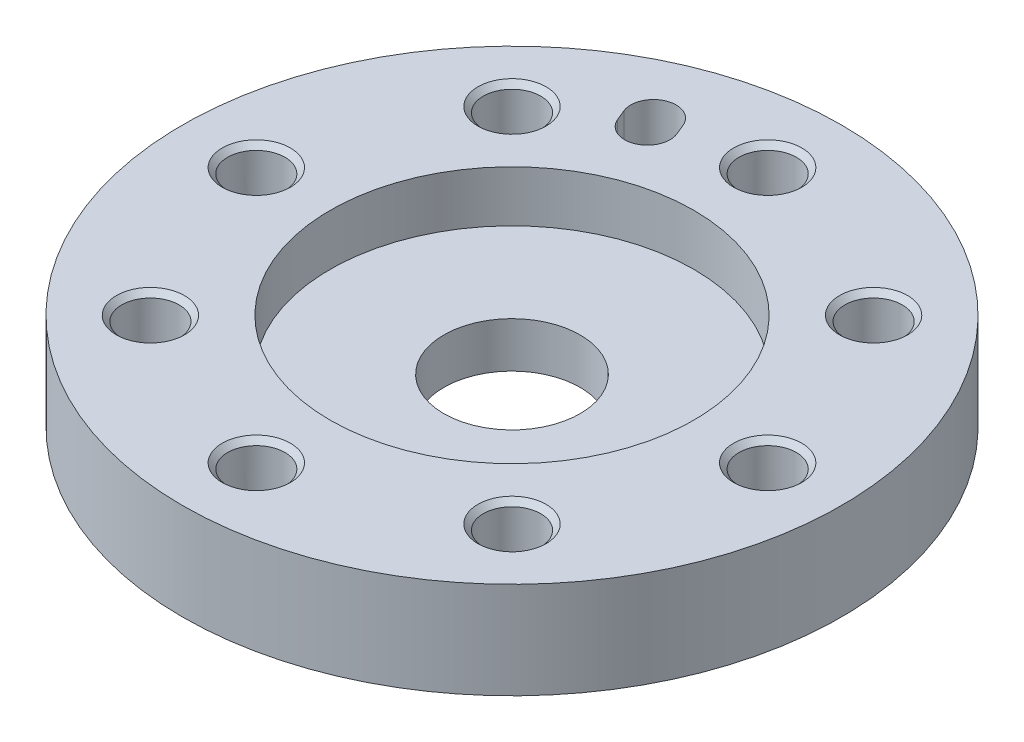
ISO-10303-21;
HEADER;
FILE_DESCRIPTION(('STEP AP214'),'2;1');
FILE_NAME('part.step','',(''),(''),'','','');
FILE_SCHEMA(('AUTOMOTIVE_DESIGN { 1 0 10303 214 1 1 1 1 }'));
ENDSEC;
DATA;
#1=APPLICATION_CONTEXT('core data for automotive mechanical design processes');
#2=APPLICATION_PROTOCOL_DEFINITION('international standard','automotive_design',2000,#1);
#3=PRODUCT_CONTEXT('',#1,'mechanical');
#4=PRODUCT('Part','Part','',(#3));
#5=PRODUCT_RELATED_PRODUCT_CATEGORY('part','',(#4));
#6=PRODUCT_DEFINITION_FORMATION('','',#4);
#7=PRODUCT_DEFINITION_CONTEXT('part definition',#1,'design');
#8=PRODUCT_DEFINITION('design','',#6,#7);
#9=PRODUCT_DEFINITION_SHAPE('','',#8);
#10=(LENGTH_UNIT() NAMED_UNIT(*) SI_UNIT(.MILLI.,.METRE.));
#11=(NAMED_UNIT(*) PLANE_ANGLE_UNIT() SI_UNIT($,.RADIAN.));
#12=(NAMED_UNIT(*) SI_UNIT($,.STERADIAN.) SOLID_ANGLE_UNIT());
#13=UNCERTAINTY_MEASURE_WITH_UNIT(LENGTH_MEASURE(1.E-05),#10,'distance_accuracy_value','');
#14=(GEOMETRIC_REPRESENTATION_CONTEXT(3) GLOBAL_UNCERTAINTY_ASSIGNED_CONTEXT((#13)) GLOBAL_UNIT_ASSIGNED_CONTEXT((#10,
#11,#12)) REPRESENTATION_CONTEXT('',''));
#15=CARTESIAN_POINT('',(0.,0.,0.));
#16=DIRECTION('',(0.,0.,1.));
#17=DIRECTION('',(1.,0.,0.));
#18=AXIS2_PLACEMENT_3D('',#15,#16,#17);
#19=CARTESIAN_POINT('',(29.293305153395,89.5,88.180194846605));
#20=DIRECTION('',(0.,-1.,0.));
#21=DIRECTION('',(0.,0.,-1.));
#22=AXIS2_PLACEMENT_3D('',#19,#20,#21);
#23=PLANE('',#22);
#24=CARTESIAN_POINT('',(31.819805153395,89.5,88.180194846605));
#25=DIRECTION('',(0.,1.,0.));
#26=DIRECTION('',(0.,0.,1.));
#27=AXIS2_PLACEMENT_3D('',#24,#25,#26);
#28=CIRCLE('',#27,5.053);
#29=CARTESIAN_POINT('',(31.819805153395,89.5,93.233194846605));
#30=VERTEX_POINT('',#29);
#31=EDGE_CURVE('E20',#30,#30,#28,.T.);
#32=ORIENTED_EDGE('',*,*,#31,.T.);
#33=EDGE_LOOP('',(#32));
#34=FACE_BOUND('',#33,.T.);
#35=ADVANCED_FACE('F17',(#34),#23,.F.);
#36=CARTESIAN_POINT('',(-2.5265,89.5,75.));
#37=DIRECTION('',(0.,-1.,0.));
#38=DIRECTION('',(0.,0.,-1.));
#39=AXIS2_PLACEMENT_3D('',#36,#37,#38);
#40=PLANE('',#39);
#41=CARTESIAN_POINT('',(0.,89.5,75.));
#42=DIRECTION('',(0.,1.,0.));
#43=DIRECTION('',(0.,0.,1.));
#44=AXIS2_PLACEMENT_3D('',#41,#42,#43);
#45=CIRCLE('',#44,5.053);
#46=CARTESIAN_POINT('',(0.,89.5,80.053));
#47=VERTEX_POINT('',#46);
#48=EDGE_CURVE('E171',#47,#47,#45,.T.);
#49=ORIENTED_EDGE('',*,*,#48,.T.);
#50=EDGE_LOOP('',(#49));
#51=FACE_BOUND('',#50,.T.);
#52=ADVANCED_FACE('F299',(#51),#40,.F.);
#53=CARTESIAN_POINT('',(-34.346305153395,89.5,88.180194846605));
#54=DIRECTION('',(0.,-1.,0.));
#55=DIRECTION('',(0.,0.,-1.));
#56=AXIS2_PLACEMENT_3D('',#53,#54,#55);
#57=PLANE('',#56);
#58=CARTESIAN_POINT('',(-31.819805153395,89.5,88.180194846605));
#59=DIRECTION('',(0.,1.,0.));
#60=DIRECTION('',(0.,0.,1.));
#61=AXIS2_PLACEMENT_3D('',#58,#59,#60);
#62=CIRCLE('',#61,5.053);
#63=CARTESIAN_POINT('',(-31.819805153395,89.5,93.233194846605));
#64=VERTEX_POINT('',#63);
#65=EDGE_CURVE('E169',#64,#64,#62,.T.);
#66=ORIENTED_EDGE('',*,*,#65,.T.);
#67=EDGE_LOOP('',(#66));
#68=FACE_BOUND('',#67,.T.);
#69=ADVANCED_FACE('F296',(#68),#57,.F.);
#70=CARTESIAN_POINT('',(-47.5265,89.5,120.));
#71=DIRECTION('',(0.,-1.,0.));
#72=DIRECTION('',(0.,0.,-1.));
#73=AXIS2_PLACEMENT_3D('',#70,#71,#72);
#74=PLANE('',#73);
#75=CARTESIAN_POINT('',(-45.,89.5,120.));
#76=DIRECTION('',(0.,1.,0.));
#77=DIRECTION('',(0.,0.,1.));
#78=AXIS2_PLACEMENT_3D('',#75,#76,#77);
#79=CIRCLE('',#78,5.053);
#80=CARTESIAN_POINT('',(-45.,89.5,125.053));
#81=VERTEX_POINT('',#80);
#82=EDGE_CURVE('E166',#81,#81,#79,.T.);
#83=ORIENTED_EDGE('',*,*,#82,.T.);
#84=EDGE_LOOP('',(#83));
#85=FACE_BOUND('',#84,.T.);
#86=ADVANCED_FACE('F298',(#85),#74,.F.);
#87=CARTESIAN_POINT('',(-34.346305153395,89.5,151.819805153395));
#88=DIRECTION('',(0.,-1.,0.));
#89=DIRECTION('',(0.,0.,-1.));
#90=AXIS2_PLACEMENT_3D('',#87,#88,#89);
#91=PLANE('',#90);
#92=CARTESIAN_POINT('',(-31.819805153395,89.5,151.819805153395));
#93=DIRECTION('',(0.,1.,0.));
#94=DIRECTION('',(0.,0.,1.));
#95=AXIS2_PLACEMENT_3D('',#92,#93,#94);
#96=CIRCLE('',#95,5.053);
#97=CARTESIAN_POINT('',(-31.819805153395,89.5,156.872805153395));
#98=VERTEX_POINT('',#97);
#99=EDGE_CURVE('E163',#98,#98,#96,.T.);
#100=ORIENTED_EDGE('',*,*,#99,.T.);
#101=EDGE_LOOP('',(#100));
#102=FACE_BOUND('',#101,.T.);
#103=ADVANCED_FACE('F306',(#102),#91,.F.);
#104=CARTESIAN_POINT('',(-2.5265,89.5,165.));
#105=DIRECTION('',(0.,-1.,0.));
#106=DIRECTION('',(0.,0.,-1.));
#107=AXIS2_PLACEMENT_3D('',#104,#105,#106);
#108=PLANE('',#107);
#109=CARTESIAN_POINT('',(0.,89.5,165.));
#110=DIRECTION('',(0.,1.,0.));
#111=DIRECTION('',(0.,0.,1.));
#112=AXIS2_PLACEMENT_3D('',#109,#110,#111);
#113=CIRCLE('',#112,5.053);
#114=CARTESIAN_POINT('',(0.,89.5,170.053));
#115=VERTEX_POINT('',#114);
#116=EDGE_CURVE('E160',#115,#115,#113,.T.);
#117=ORIENTED_EDGE('',*,*,#116,.T.);
#118=EDGE_LOOP('',(#117));
#119=FACE_BOUND('',#118,.T.);
#120=ADVANCED_FACE('F312',(#119),#108,.F.);
#121=CARTESIAN_POINT('',(29.293305153395,89.5,151.819805153395));
#122=DIRECTION('',(0.,-1.,0.));
#123=DIRECTION('',(0.,0.,-1.));
#124=AXIS2_PLACEMENT_3D('',#121,#122,#123);
#125=PLANE('',#124);
#126=CARTESIAN_POINT('',(31.819805153395,89.5,151.819805153395));
#127=DIRECTION('',(0.,1.,0.));
#128=DIRECTION('',(0.,0.,1.));
#129=AXIS2_PLACEMENT_3D('',#126,#127,#128);
#130=CIRCLE('',#129,5.053);
#131=CARTESIAN_POINT('',(31.819805153395,89.5,156.872805153395));
#132=VERTEX_POINT('',#131);
#133=EDGE_CURVE('E157',#132,#132,#130,.T.);
#134=ORIENTED_EDGE('',*,*,#133,.T.);
#135=EDGE_LOOP('',(#134));
#136=FACE_BOUND('',#135,.T.);
#137=ADVANCED_FACE('F316',(#136),#125,.F.);
#138=CARTESIAN_POINT('',(42.4735,89.5,120.));
#139=DIRECTION('',(0.,-1.,0.));
#140=DIRECTION('',(0.,0.,-1.));
#141=AXIS2_PLACEMENT_3D('',#138,#139,#140);
#142=PLANE('',#141);
#143=CARTESIAN_POINT('',(45.,89.5,120.));
#144=DIRECTION('',(0.,1.,0.));
#145=DIRECTION('',(0.,0.,1.));
#146=AXIS2_PLACEMENT_3D('',#143,#144,#145);
#147=CIRCLE('',#146,5.053);
#148=CARTESIAN_POINT('',(45.,89.5,125.053));
#149=VERTEX_POINT('',#148);
#150=EDGE_CURVE('E69',#149,#149,#147,.T.);
#151=ORIENTED_EDGE('',*,*,#150,.T.);
#152=EDGE_LOOP('',(#151));
#153=FACE_BOUND('',#152,.T.);
#154=ADVANCED_FACE('F193',(#153),#142,.F.);
#155=CARTESIAN_POINT('',(0.,97.5,120.));
#156=DIRECTION('',(0.,1.,0.));
#157=DIRECTION('',(0.,0.,1.));
#158=AXIS2_PLACEMENT_3D('',#155,#156,#157);
#159=PLANE('',#158);
#160=DIRECTION('',(-0.382683432365091,0.,-0.923879532511286));
#161=VECTOR('',#160,1.);
#162=CARTESIAN_POINT('',(-13.1425528940188,97.5,77.818566840043));
#163=LINE('',#162,#161);
#164=CARTESIAN_POINT('',(-13.1425528940188,97.5,77.818566840043));
#165=VERTEX_POINT('',#164);
#166=CARTESIAN_POINT('',(-13.907919758749,97.5,75.9708077750204));
#167=VERTEX_POINT('',#166);
#168=EDGE_CURVE('E72',#165,#167,#163,.T.);
#169=ORIENTED_EDGE('',*,*,#168,.T.);
#170=CARTESIAN_POINT('',(-17.6034378887941,97.5,77.5015415044808));
#171=DIRECTION('',(0.,1.,0.));
#172=DIRECTION('',(0.,0.,1.));
#173=AXIS2_PLACEMENT_3D('',#170,#171,#172);
#174=CIRCLE('',#173,4.);
#175=CARTESIAN_POINT('',(-21.2989560188392,97.5,79.0322752339412));
#176=VERTEX_POINT('',#175);
#177=EDGE_CURVE('E55',#167,#176,#174,.T.);
#178=ORIENTED_EDGE('',*,*,#177,.T.);
#179=DIRECTION('',(0.382683432365091,0.,0.923879532511286));
#180=VECTOR('',#179,1.);
#181=CARTESIAN_POINT('',(-21.2989560188393,97.5,79.0322752339412));
#182=LINE('',#181,#180);
#183=CARTESIAN_POINT('',(-20.5335891541091,97.5,80.8800342989638));
#184=VERTEX_POINT('',#183);
#185=EDGE_CURVE('E60',#176,#184,#182,.T.);
#186=ORIENTED_EDGE('',*,*,#185,.T.);
#187=CARTESIAN_POINT('',(-16.8380710240639,97.5,79.3493005695034));
#188=DIRECTION('',(0.,1.,0.));
#189=DIRECTION('',(0.,0.,1.));
#190=AXIS2_PLACEMENT_3D('',#187,#188,#189);
#191=CIRCLE('',#190,4.);
#192=EDGE_CURVE('E108',#184,#165,#191,.T.);
#193=ORIENTED_EDGE('',*,*,#192,.T.);
#194=EDGE_LOOP('',(#169,#178,#186,#193));
#195=FACE_BOUND('',#194,.T.);
#196=ADVANCED_FACE('F71',(#195),#159,.T.);
#197=CARTESIAN_POINT('',(31.819805153395,97.2765,88.180194846605));
#198=DIRECTION('',(0.,1.,0.));
#199=DIRECTION('',(0.,0.,1.));
#200=AXIS2_PLACEMENT_3D('',#197,#198,#199);
#201=CYLINDRICAL_SURFACE('',#200,5.053);
#202=CARTESIAN_POINT('',(31.819805153395,105.053000000055,88.180194846605));
#203=DIRECTION('',(0.,1.,0.));
#204=DIRECTION('',(-1.,0.,0.));
#205=AXIS2_PLACEMENT_3D('',#202,#203,#204);
#206=CIRCLE('',#205,5.05300000000897);
#207=CARTESIAN_POINT('',(26.766805153386,105.053000000055,88.180194846605));
#208=VERTEX_POINT('',#207);
#209=EDGE_CURVE('E106',#208,#208,#206,.T.);
#210=ORIENTED_EDGE('',*,*,#209,.T.);
#211=EDGE_LOOP('',(#210));
#212=FACE_BOUND('',#211,.T.);
#213=ORIENTED_EDGE('',*,*,#31,.F.);
#214=EDGE_LOOP('',(#213));
#215=FACE_BOUND('',#214,.T.);
#216=ADVANCED_FACE('F179',(#212,#215),#201,.F.);
#217=CARTESIAN_POINT('',(0.,97.2765,75.));
#218=DIRECTION('',(0.,1.,0.));
#219=DIRECTION('',(0.,0.,1.));
#220=AXIS2_PLACEMENT_3D('',#217,#218,#219);
#221=CYLINDRICAL_SURFACE('',#220,5.053);
#222=CARTESIAN_POINT('',(0.,105.053000000055,75.));
#223=DIRECTION('',(0.,1.,0.));
#224=DIRECTION('',(-1.,0.,0.));
#225=AXIS2_PLACEMENT_3D('',#222,#223,#224);
#226=CIRCLE('',#225,5.05299999997533);
#227=CARTESIAN_POINT('',(-5.05299999997533,105.053000000055,75.));
#228=VERTEX_POINT('',#227);
#229=EDGE_CURVE('E103',#228,#228,#226,.T.);
#230=ORIENTED_EDGE('',*,*,#229,.T.);
#231=EDGE_LOOP('',(#230));
#232=FACE_BOUND('',#231,.T.);
#233=ORIENTED_EDGE('',*,*,#48,.F.);
#234=EDGE_LOOP('',(#233));
#235=FACE_BOUND('',#234,.T.);
#236=ADVANCED_FACE('F181',(#232,#235),#221,.F.);
#237=CARTESIAN_POINT('',(-31.819805153395,97.2765,88.180194846605));
#238=DIRECTION('',(0.,1.,0.));
#239=DIRECTION('',(0.,0.,1.));
#240=AXIS2_PLACEMENT_3D('',#237,#238,#239);
#241=CYLINDRICAL_SURFACE('',#240,5.053);
#242=CARTESIAN_POINT('',(-31.819805153395,105.052999999941,88.180194846605));
#243=DIRECTION('',(0.,1.,0.));
#244=DIRECTION('',(-1.,0.,0.));
#245=AXIS2_PLACEMENT_3D('',#242,#243,#244);
#246=CIRCLE('',#245,5.05300000005537);
#247=CARTESIAN_POINT('',(-36.8728051534504,105.052999999941,88.180194846605));
#248=VERTEX_POINT('',#247);
#249=EDGE_CURVE('E100',#248,#248,#246,.T.);
#250=ORIENTED_EDGE('',*,*,#249,.T.);
#251=EDGE_LOOP('',(#250));
#252=FACE_BOUND('',#251,.T.);
#253=ORIENTED_EDGE('',*,*,#65,.F.);
#254=EDGE_LOOP('',(#253));
#255=FACE_BOUND('',#254,.T.);
#256=ADVANCED_FACE('F190',(#252,#255),#241,.F.);
#257=CARTESIAN_POINT('',(-45.,97.2765,120.));
#258=DIRECTION('',(0.,1.,0.));
#259=DIRECTION('',(0.,0.,1.));
#260=AXIS2_PLACEMENT_3D('',#257,#258,#259);
#261=CYLINDRICAL_SURFACE('',#260,5.053);
#262=CARTESIAN_POINT('',(-45.,105.052999999941,120.));
#263=DIRECTION('',(0.,1.,0.));
#264=DIRECTION('',(-1.,0.,0.));
#265=AXIS2_PLACEMENT_3D('',#262,#263,#264);
#266=CIRCLE('',#265,5.05300000004809);
#267=CARTESIAN_POINT('',(-50.0530000000481,105.052999999941,120.));
#268=VERTEX_POINT('',#267);
#269=EDGE_CURVE('E97',#268,#268,#266,.T.);
#270=ORIENTED_EDGE('',*,*,#269,.T.);
#271=EDGE_LOOP('',(#270));
#272=FACE_BOUND('',#271,.T.);
#273=ORIENTED_EDGE('',*,*,#82,.F.);
#274=EDGE_LOOP('',(#273));
#275=FACE_BOUND('',#274,.T.);
#276=ADVANCED_FACE('F282',(#272,#275),#261,.F.);
#277=CARTESIAN_POINT('',(-31.819805153395,97.2765,151.819805153395));
#278=DIRECTION('',(0.,1.,0.));
#279=DIRECTION('',(0.,0.,1.));
#280=AXIS2_PLACEMENT_3D('',#277,#278,#279);
#281=CYLINDRICAL_SURFACE('',#280,5.053);
#282=CARTESIAN_POINT('',(-31.819805153395,105.052999999941,151.819805153395));
#283=DIRECTION('',(0.,1.,0.));
#284=DIRECTION('',(-1.,0.,0.));
#285=AXIS2_PLACEMENT_3D('',#282,#283,#284);
#286=CIRCLE('',#285,5.05300000005537);
#287=CARTESIAN_POINT('',(-36.8728051534504,105.052999999941,151.819805153395));
#288=VERTEX_POINT('',#287);
#289=EDGE_CURVE('E94',#288,#288,#286,.T.);
#290=ORIENTED_EDGE('',*,*,#289,.T.);
#291=EDGE_LOOP('',(#290));
#292=FACE_BOUND('',#291,.T.);
#293=ORIENTED_EDGE('',*,*,#99,.F.);
#294=EDGE_LOOP('',(#293));
#295=FACE_BOUND('',#294,.T.);
#296=ADVANCED_FACE('F278',(#292,#295),#281,.F.);
#297=CARTESIAN_POINT('',(0.,97.2765,165.));
#298=DIRECTION('',(0.,1.,0.));
#299=DIRECTION('',(0.,0.,1.));
#300=AXIS2_PLACEMENT_3D('',#297,#298,#299);
#301=CYLINDRICAL_SURFACE('',#300,5.053);
#302=CARTESIAN_POINT('',(0.,105.053000000055,165.));
#303=DIRECTION('',(0.,1.,0.));
#304=DIRECTION('',(-1.,0.,0.));
#305=AXIS2_PLACEMENT_3D('',#302,#303,#304);
#306=CIRCLE('',#305,5.05299999997533);
#307=CARTESIAN_POINT('',(-5.05299999997533,105.053000000055,165.));
#308=VERTEX_POINT('',#307);
#309=EDGE_CURVE('E91',#308,#308,#306,.T.);
#310=ORIENTED_EDGE('',*,*,#309,.T.);
#311=EDGE_LOOP('',(#310));
#312=FACE_BOUND('',#311,.T.);
#313=ORIENTED_EDGE('',*,*,#116,.F.);
#314=EDGE_LOOP('',(#313));
#315=FACE_BOUND('',#314,.T.);
#316=ADVANCED_FACE('F274',(#312,#315),#301,.F.);
#317=CARTESIAN_POINT('',(31.819805153395,97.2765,151.819805153395));
#318=DIRECTION('',(0.,1.,0.));
#319=DIRECTION('',(0.,0.,1.));
#320=AXIS2_PLACEMENT_3D('',#317,#318,#319);
#321=CYLINDRICAL_SURFACE('',#320,5.053);
#322=CARTESIAN_POINT('',(31.819805153395,105.053000000055,151.819805153395));
#323=DIRECTION('',(0.,1.,0.));
#324=DIRECTION('',(-1.,0.,0.));
#325=AXIS2_PLACEMENT_3D('',#322,#323,#324);
#326=CIRCLE('',#325,5.05300000000897);
#327=CARTESIAN_POINT('',(26.766805153386,105.053000000055,151.819805153395));
#328=VERTEX_POINT('',#327);
#329=EDGE_CURVE('E88',#328,#328,#326,.T.);
#330=ORIENTED_EDGE('',*,*,#329,.T.);
#331=EDGE_LOOP('',(#330));
#332=FACE_BOUND('',#331,.T.);
#333=ORIENTED_EDGE('',*,*,#133,.F.);
#334=EDGE_LOOP('',(#333));
#335=FACE_BOUND('',#334,.T.);
#336=ADVANCED_FACE('F270',(#332,#335),#321,.F.);
#337=CARTESIAN_POINT('',(45.,97.2765,120.));
#338=DIRECTION('',(0.,1.,0.));
#339=DIRECTION('',(0.,0.,1.));
#340=AXIS2_PLACEMENT_3D('',#337,#338,#339);
#341=CYLINDRICAL_SURFACE('',#340,5.053);
#342=CARTESIAN_POINT('',(45.,105.052999999941,120.));
#343=DIRECTION('',(0.,1.,0.));
#344=DIRECTION('',(-1.,0.,0.));
#345=AXIS2_PLACEMENT_3D('',#342,#343,#344);
#346=CIRCLE('',#345,5.0530000000731);
#347=CARTESIAN_POINT('',(39.9469999999269,105.052999999941,120.));
#348=VERTEX_POINT('',#347);
#349=EDGE_CURVE('E84',#348,#348,#346,.T.);
#350=ORIENTED_EDGE('',*,*,#349,.T.);
#351=EDGE_LOOP('',(#350));
#352=FACE_BOUND('',#351,.T.);
#353=ORIENTED_EDGE('',*,*,#150,.F.);
#354=EDGE_LOOP('',(#353));
#355=FACE_BOUND('',#354,.T.);
#356=ADVANCED_FACE('F267',(#352,#355),#341,.F.);
#357=CARTESIAN_POINT('',(-21.2989560188393,106.,79.0322752339412));
#358=DIRECTION('',(-0.923879532511286,0.,0.382683432365091));
#359=DIRECTION('',(0.382683432365091,0.,0.923879532511286));
#360=AXIS2_PLACEMENT_3D('',#357,#358,#359);
#361=PLANE('',#360);
#362=DIRECTION('',(0.,1.,0.));
#363=VECTOR('',#362,1.);
#364=CARTESIAN_POINT('',(-21.2989560188392,106.,79.0322752339412));
#365=LINE('',#364,#363);
#366=CARTESIAN_POINT('',(-21.2989560188392,106.,79.0322752339412));
#367=VERTEX_POINT('',#366);
#368=EDGE_CURVE('E62',#176,#367,#365,.T.);
#369=ORIENTED_EDGE('',*,*,#368,.T.);
#370=DIRECTION('',(-0.382683432365093,0.,-0.923879532511285));
#371=VECTOR('',#370,1.);
#372=CARTESIAN_POINT('',(-20.5335891541091,106.,80.8800342989638));
#373=LINE('',#372,#371);
#374=CARTESIAN_POINT('',(-20.5335891541091,106.,80.8800342989638));
#375=VERTEX_POINT('',#374);
#376=EDGE_CURVE('E151',#375,#367,#373,.T.);
#377=ORIENTED_EDGE('',*,*,#376,.F.);
#378=DIRECTION('',(0.,1.,0.));
#379=VECTOR('',#378,1.);
#380=CARTESIAN_POINT('',(-20.533589154109,106.,80.8800342989638));
#381=LINE('',#380,#379);
#382=EDGE_CURVE('E65',#375,#184,#381,.F.);
#383=ORIENTED_EDGE('',*,*,#382,.T.);
#384=ORIENTED_EDGE('',*,*,#185,.F.);
#385=EDGE_LOOP('',(#369,#377,#383,#384));
#386=FACE_BOUND('',#385,.T.);
#387=ADVANCED_FACE('F61',(#386),#361,.F.);
#388=CARTESIAN_POINT('',(-17.6034378887941,106.,77.5015415044808));
#389=DIRECTION('',(0.,1.,0.));
#390=DIRECTION('',(0.,0.,1.));
#391=AXIS2_PLACEMENT_3D('',#388,#389,#390);
#392=CYLINDRICAL_SURFACE('',#391,4.);
#393=DIRECTION('',(0.,1.,0.));
#394=VECTOR('',#393,1.);
#395=CARTESIAN_POINT('',(-13.907919758749,106.,75.9708077750204));
#396=LINE('',#395,#394);
#397=CARTESIAN_POINT('',(-13.907919758749,106.,75.9708077750204));
#398=VERTEX_POINT('',#397);
#399=EDGE_CURVE('E74',#167,#398,#396,.T.);
#400=ORIENTED_EDGE('',*,*,#399,.T.);
#401=CARTESIAN_POINT('',(-17.6034378887941,106.,77.5015415044808));
#402=DIRECTION('',(0.,1.,0.));
#403=DIRECTION('',(0.,0.,1.));
#404=AXIS2_PLACEMENT_3D('',#401,#402,#403);
#405=CIRCLE('',#404,4.);
#406=EDGE_CURVE('E78',#367,#398,#405,.F.);
#407=ORIENTED_EDGE('',*,*,#406,.F.);
#408=ORIENTED_EDGE('',*,*,#368,.F.);
#409=ORIENTED_EDGE('',*,*,#177,.F.);
#410=EDGE_LOOP('',(#400,#407,#408,#409));
#411=FACE_BOUND('',#410,.T.);
#412=ADVANCED_FACE('F76',(#411),#392,.F.);
#413=CARTESIAN_POINT('',(-13.1425528940188,106.,77.818566840043));
#414=DIRECTION('',(0.923879532511286,0.,-0.382683432365091));
#415=DIRECTION('',(-0.382683432365091,0.,-0.923879532511286));
#416=AXIS2_PLACEMENT_3D('',#413,#414,#415);
#417=PLANE('',#416);
#418=DIRECTION('',(0.,1.,0.));
#419=VECTOR('',#418,1.);
#420=CARTESIAN_POINT('',(-13.1425528940188,106.,77.818566840043));
#421=LINE('',#420,#419);
#422=CARTESIAN_POINT('',(-13.1425528940188,106.,77.818566840043));
#423=VERTEX_POINT('',#422);
#424=EDGE_CURVE('E35',#165,#423,#421,.T.);
#425=ORIENTED_EDGE('',*,*,#424,.T.);
#426=DIRECTION('',(0.382683432365094,0.,0.923879532511285));
#427=VECTOR('',#426,1.);
#428=CARTESIAN_POINT('',(-13.907919758749,106.,75.9708077750204));
#429=LINE('',#428,#427);
#430=EDGE_CURVE('E149',#398,#423,#429,.T.);
#431=ORIENTED_EDGE('',*,*,#430,.F.);
#432=ORIENTED_EDGE('',*,*,#399,.F.);
#433=ORIENTED_EDGE('',*,*,#168,.F.);
#434=EDGE_LOOP('',(#425,#431,#432,#433));
#435=FACE_BOUND('',#434,.T.);
#436=ADVANCED_FACE('F259',(#435),#417,.F.);
#437=CARTESIAN_POINT('',(-16.8380710240639,106.,79.3493005695034));
#438=DIRECTION('',(0.,1.,0.));
#439=DIRECTION('',(0.,0.,1.));
#440=AXIS2_PLACEMENT_3D('',#437,#438,#439);
#441=CYLINDRICAL_SURFACE('',#440,4.);
#442=ORIENTED_EDGE('',*,*,#382,.F.);
#443=CARTESIAN_POINT('',(-16.8380710240639,106.,79.3493005695034));
#444=DIRECTION('',(0.,1.,0.));
#445=DIRECTION('',(0.,0.,1.));
#446=AXIS2_PLACEMENT_3D('',#443,#444,#445);
#447=CIRCLE('',#446,4.);
#448=EDGE_CURVE('E146',#423,#375,#447,.F.);
#449=ORIENTED_EDGE('',*,*,#448,.F.);
#450=ORIENTED_EDGE('',*,*,#424,.F.);
#451=ORIENTED_EDGE('',*,*,#192,.F.);
#452=EDGE_LOOP('',(#442,#449,#450,#451));
#453=FACE_BOUND('',#452,.T.);
#454=ADVANCED_FACE('F255',(#453),#441,.F.);
#455=CARTESIAN_POINT('',(31.819805153395,105.999999999938,88.180194846605));
#456=DIRECTION('',(0.,1.,0.));
#457=DIRECTION('',(0.,0.,1.));
#458=AXIS2_PLACEMENT_3D('',#455,#456,#457);
#459=CONICAL_SURFACE('',#458,5.99999999989176,0.785398163367436);
#460=CARTESIAN_POINT('',(31.819805153395,105.999999999994,88.180194846605));
#461=DIRECTION('',(0.,1.,0.));
#462=DIRECTION('',(0.,0.,1.));
#463=AXIS2_PLACEMENT_3D('',#460,#461,#462);
#464=CIRCLE('',#463,5.9999999999486);
#465=CARTESIAN_POINT('',(31.819805153395,105.999999999994,94.1801948465536));
#466=VERTEX_POINT('',#465);
#467=EDGE_CURVE('E143',#466,#466,#464,.F.);
#468=ORIENTED_EDGE('',*,*,#467,.F.);
#469=EDGE_LOOP('',(#468));
#470=FACE_BOUND('',#469,.T.);
#471=ORIENTED_EDGE('',*,*,#209,.F.);
#472=EDGE_LOOP('',(#471));
#473=FACE_BOUND('',#472,.T.);
#474=ADVANCED_FACE('F251',(#470,#473),#459,.F.);
#475=CARTESIAN_POINT('',(0.,105.999999999938,75.));
#476=DIRECTION('',(0.,1.,0.));
#477=DIRECTION('',(0.,0.,1.));
#478=AXIS2_PLACEMENT_3D('',#475,#476,#477);
#479=CONICAL_SURFACE('',#478,5.99999999985812,0.785398163367436);
#480=CARTESIAN_POINT('',(0.,105.999999999994,75.));
#481=DIRECTION('',(0.,1.,0.));
#482=DIRECTION('',(0.,0.,1.));
#483=AXIS2_PLACEMENT_3D('',#480,#481,#482);
#484=CIRCLE('',#483,5.99999999991496);
#485=CARTESIAN_POINT('',(0.,105.999999999994,80.999999999915));
#486=VERTEX_POINT('',#485);
#487=EDGE_CURVE('E140',#486,#486,#484,.F.);
#488=ORIENTED_EDGE('',*,*,#487,.F.);
#489=EDGE_LOOP('',(#488));
#490=FACE_BOUND('',#489,.T.);
#491=ORIENTED_EDGE('',*,*,#229,.F.);
#492=EDGE_LOOP('',(#491));
#493=FACE_BOUND('',#492,.T.);
#494=ADVANCED_FACE('F247',(#490,#493),#479,.F.);
#495=CARTESIAN_POINT('',(-31.819805153395,105.999999999938,88.180194846605));
#496=DIRECTION('',(0.,1.,0.));
#497=DIRECTION('',(0.,0.,1.));
#498=AXIS2_PLACEMENT_3D('',#495,#496,#497);
#499=CONICAL_SURFACE('',#498,5.99999999999501,0.785398163367436);
#500=CARTESIAN_POINT('',(-31.819805153395,105.999999999938,88.180194846605));
#501=DIRECTION('',(0.,1.,0.));
#502=DIRECTION('',(0.,0.,1.));
#503=AXIS2_PLACEMENT_3D('',#500,#501,#502);
#504=CIRCLE('',#503,5.99999999999501);
#505=CARTESIAN_POINT('',(-31.819805153395,105.999999999938,94.1801948466));
#506=VERTEX_POINT('',#505);
#507=EDGE_CURVE('E137',#506,#506,#504,.F.);
#508=ORIENTED_EDGE('',*,*,#507,.F.);
#509=EDGE_LOOP('',(#508));
#510=FACE_BOUND('',#509,.T.);
#511=ORIENTED_EDGE('',*,*,#249,.F.);
#512=EDGE_LOOP('',(#511));
#513=FACE_BOUND('',#512,.T.);
#514=ADVANCED_FACE('F243',(#510,#513),#499,.F.);
#515=CARTESIAN_POINT('',(-45.,105.999999999938,120.));
#516=DIRECTION('',(0.,1.,0.));
#517=DIRECTION('',(0.,0.,1.));
#518=AXIS2_PLACEMENT_3D('',#515,#516,#517);
#519=CONICAL_SURFACE('',#518,5.99999999998772,0.785398163367436);
#520=CARTESIAN_POINT('',(-45.,105.999999999938,120.));
#521=DIRECTION('',(0.,1.,0.));
#522=DIRECTION('',(0.,0.,1.));
#523=AXIS2_PLACEMENT_3D('',#520,#521,#522);
#524=CIRCLE('',#523,5.99999999998772);
#525=CARTESIAN_POINT('',(-45.,105.999999999938,125.999999999988));
#526=VERTEX_POINT('',#525);
#527=EDGE_CURVE('E134',#526,#526,#524,.F.);
#528=ORIENTED_EDGE('',*,*,#527,.F.);
#529=EDGE_LOOP('',(#528));
#530=FACE_BOUND('',#529,.T.);
#531=ORIENTED_EDGE('',*,*,#269,.F.);
#532=EDGE_LOOP('',(#531));
#533=FACE_BOUND('',#532,.T.);
#534=ADVANCED_FACE('F239',(#530,#533),#519,.F.);
#535=CARTESIAN_POINT('',(-31.819805153395,105.999999999938,151.819805153395));
#536=DIRECTION('',(0.,1.,0.));
#537=DIRECTION('',(0.,0.,1.));
#538=AXIS2_PLACEMENT_3D('',#535,#536,#537);
#539=CONICAL_SURFACE('',#538,5.99999999999501,0.785398163367436);
#540=CARTESIAN_POINT('',(-31.819805153395,105.999999999938,151.819805153395));
#541=DIRECTION('',(0.,1.,0.));
#542=DIRECTION('',(0.,0.,1.));
#543=AXIS2_PLACEMENT_3D('',#540,#541,#542);
#544=CIRCLE('',#543,5.99999999999501);
#545=CARTESIAN_POINT('',(-31.819805153395,105.999999999938,157.81980515339));
#546=VERTEX_POINT('',#545);
#547=EDGE_CURVE('E131',#546,#546,#544,.F.);
#548=ORIENTED_EDGE('',*,*,#547,.F.);
#549=EDGE_LOOP('',(#548));
#550=FACE_BOUND('',#549,.T.);
#551=ORIENTED_EDGE('',*,*,#289,.F.);
#552=EDGE_LOOP('',(#551));
#553=FACE_BOUND('',#552,.T.);
#554=ADVANCED_FACE('F235',(#550,#553),#539,.F.);
#555=CARTESIAN_POINT('',(0.,105.999999999938,165.));
#556=DIRECTION('',(0.,1.,0.));
#557=DIRECTION('',(0.,0.,1.));
#558=AXIS2_PLACEMENT_3D('',#555,#556,#557);
#559=CONICAL_SURFACE('',#558,5.99999999985812,0.785398163367436);
#560=CARTESIAN_POINT('',(0.,105.999999999994,165.));
#561=DIRECTION('',(0.,1.,0.));
#562=DIRECTION('',(0.,0.,1.));
#563=AXIS2_PLACEMENT_3D('',#560,#561,#562);
#564=CIRCLE('',#563,5.99999999991496);
#565=CARTESIAN_POINT('',(0.,105.999999999994,170.999999999915));
#566=VERTEX_POINT('',#565);
#567=EDGE_CURVE('E128',#566,#566,#564,.F.);
#568=ORIENTED_EDGE('',*,*,#567,.F.);
#569=EDGE_LOOP('',(#568));
#570=FACE_BOUND('',#569,.T.);
#571=ORIENTED_EDGE('',*,*,#309,.F.);
#572=EDGE_LOOP('',(#571));
#573=FACE_BOUND('',#572,.T.);
#574=ADVANCED_FACE('F231',(#570,#573),#559,.F.);
#575=CARTESIAN_POINT('',(31.819805153395,105.999999999938,151.819805153395));
#576=DIRECTION('',(0.,1.,0.));
#577=DIRECTION('',(0.,0.,1.));
#578=AXIS2_PLACEMENT_3D('',#575,#576,#577);
#579=CONICAL_SURFACE('',#578,5.99999999989176,0.785398163367436);
#580=CARTESIAN_POINT('',(31.819805153395,105.999999999994,151.819805153395));
#581=DIRECTION('',(0.,1.,0.));
#582=DIRECTION('',(0.,0.,1.));
#583=AXIS2_PLACEMENT_3D('',#580,#581,#582);
#584=CIRCLE('',#583,5.9999999999486);
#585=CARTESIAN_POINT('',(31.819805153395,105.999999999994,157.819805153344));
#586=VERTEX_POINT('',#585);
#587=EDGE_CURVE('E125',#586,#586,#584,.F.);
#588=ORIENTED_EDGE('',*,*,#587,.F.);
#589=EDGE_LOOP('',(#588));
#590=FACE_BOUND('',#589,.T.);
#591=ORIENTED_EDGE('',*,*,#329,.F.);
#592=EDGE_LOOP('',(#591));
#593=FACE_BOUND('',#592,.T.);
#594=ADVANCED_FACE('F227',(#590,#593),#579,.F.);
#595=CARTESIAN_POINT('',(45.,105.999999999938,120.));
#596=DIRECTION('',(0.,1.,0.));
#597=DIRECTION('',(0.,0.,1.));
#598=AXIS2_PLACEMENT_3D('',#595,#596,#597);
#599=CONICAL_SURFACE('',#598,6.00000000001273,0.785398163367436);
#600=CARTESIAN_POINT('',(45.,105.999999999938,120.));
#601=DIRECTION('',(0.,1.,0.));
#602=DIRECTION('',(0.,0.,1.));
#603=AXIS2_PLACEMENT_3D('',#600,#601,#602);
#604=CIRCLE('',#603,6.00000000001273);
#605=CARTESIAN_POINT('',(45.,105.999999999938,126.000000000013));
#606=VERTEX_POINT('',#605);
#607=EDGE_CURVE('E122',#606,#606,#604,.F.);
#608=ORIENTED_EDGE('',*,*,#607,.F.);
#609=EDGE_LOOP('',(#608));
#610=FACE_BOUND('',#609,.T.);
#611=ORIENTED_EDGE('',*,*,#349,.F.);
#612=EDGE_LOOP('',(#611));
#613=FACE_BOUND('',#612,.T.);
#614=ADVANCED_FACE('F223',(#610,#613),#599,.F.);
#615=CARTESIAN_POINT('',(0.,101.5,120.));
#616=DIRECTION('',(0.,-1.,0.));
#617=DIRECTION('',(0.,0.,-1.));
#618=AXIS2_PLACEMENT_3D('',#615,#616,#617);
#619=CYLINDRICAL_SURFACE('',#618,32.);
#620=CARTESIAN_POINT('',(0.,97.,120.));
#621=DIRECTION('',(0.,-1.,0.));
#622=DIRECTION('',(0.,0.,-1.));
#623=AXIS2_PLACEMENT_3D('',#620,#621,#622);
#624=CIRCLE('',#623,32.);
#625=CARTESIAN_POINT('',(0.,97.,88.));
#626=VERTEX_POINT('',#625);
#627=EDGE_CURVE('E87',#626,#626,#624,.F.);
#628=ORIENTED_EDGE('',*,*,#627,.F.);
#629=EDGE_LOOP('',(#628));
#630=FACE_BOUND('',#629,.T.);
#631=CARTESIAN_POINT('',(0.,106.,120.));
#632=DIRECTION('',(0.,-1.,0.));
#633=DIRECTION('',(0.,0.,-1.));
#634=AXIS2_PLACEMENT_3D('',#631,#632,#633);
#635=CIRCLE('',#634,32.);
#636=CARTESIAN_POINT('',(0.,106.,88.));
#637=VERTEX_POINT('',#636);
#638=EDGE_CURVE('E119',#637,#637,#635,.T.);
#639=ORIENTED_EDGE('',*,*,#638,.F.);
#640=EDGE_LOOP('',(#639));
#641=FACE_BOUND('',#640,.T.);
#642=ADVANCED_FACE('F219',(#630,#641),#619,.F.);
#643=CARTESIAN_POINT('',(16.,97.,120.));
#644=DIRECTION('',(0.,1.,0.));
#645=DIRECTION('',(0.,0.,1.));
#646=AXIS2_PLACEMENT_3D('',#643,#644,#645);
#647=PLANE('',#646);
#648=ORIENTED_EDGE('',*,*,#627,.T.);
#649=EDGE_LOOP('',(#648));
#650=FACE_BOUND('',#649,.T.);
#651=CARTESIAN_POINT('',(0.,97.,120.));
#652=DIRECTION('',(0.,1.,0.));
#653=DIRECTION('',(0.,0.,1.));
#654=AXIS2_PLACEMENT_3D('',#651,#652,#653);
#655=CIRCLE('',#654,12.);
#656=CARTESIAN_POINT('',(0.,97.,132.));
#657=VERTEX_POINT('',#656);
#658=EDGE_CURVE('E116',#657,#657,#655,.F.);
#659=ORIENTED_EDGE('',*,*,#658,.T.);
#660=EDGE_LOOP('',(#659));
#661=FACE_BOUND('',#660,.T.);
#662=ADVANCED_FACE('F215',(#650,#661),#647,.T.);
#663=CARTESIAN_POINT('',(45.,106.,120.));
#664=DIRECTION('',(0.,1.,0.));
#665=DIRECTION('',(0.,0.,1.));
#666=AXIS2_PLACEMENT_3D('',#663,#664,#665);
#667=PLANE('',#666);
#668=CARTESIAN_POINT('',(0.,106.,120.));
#669=DIRECTION('',(0.,-1.,0.));
#670=DIRECTION('',(0.,0.,-1.));
#671=AXIS2_PLACEMENT_3D('',#668,#669,#670);
#672=CIRCLE('',#671,58.);
#673=CARTESIAN_POINT('',(0.,106.,62.));
#674=VERTEX_POINT('',#673);
#675=EDGE_CURVE('E113',#674,#674,#672,.T.);
#676=ORIENTED_EDGE('',*,*,#675,.F.);
#677=EDGE_LOOP('',(#676));
#678=FACE_BOUND('',#677,.T.);
#679=ORIENTED_EDGE('',*,*,#638,.T.);
#680=EDGE_LOOP('',(#679));
#681=FACE_BOUND('',#680,.T.);
#682=ORIENTED_EDGE('',*,*,#607,.T.);
#683=EDGE_LOOP('',(#682));
#684=FACE_BOUND('',#683,.T.);
#685=ORIENTED_EDGE('',*,*,#587,.T.);
#686=EDGE_LOOP('',(#685));
#687=FACE_BOUND('',#686,.T.);
#688=ORIENTED_EDGE('',*,*,#567,.T.);
#689=EDGE_LOOP('',(#688));
#690=FACE_BOUND('',#689,.T.);
#691=ORIENTED_EDGE('',*,*,#547,.T.);
#692=EDGE_LOOP('',(#691));
#693=FACE_BOUND('',#692,.T.);
#694=ORIENTED_EDGE('',*,*,#527,.T.);
#695=EDGE_LOOP('',(#694));
#696=FACE_BOUND('',#695,.T.);
#697=ORIENTED_EDGE('',*,*,#507,.T.);
#698=EDGE_LOOP('',(#697));
#699=FACE_BOUND('',#698,.T.);
#700=ORIENTED_EDGE('',*,*,#487,.T.);
#701=EDGE_LOOP('',(#700));
#702=FACE_BOUND('',#701,.T.);
#703=ORIENTED_EDGE('',*,*,#467,.T.);
#704=EDGE_LOOP('',(#703));
#705=FACE_BOUND('',#704,.T.);
#706=ORIENTED_EDGE('',*,*,#430,.T.);
#707=ORIENTED_EDGE('',*,*,#448,.T.);
#708=ORIENTED_EDGE('',*,*,#376,.T.);
#709=ORIENTED_EDGE('',*,*,#406,.T.);
#710=EDGE_LOOP('',(#706,#707,#708,#709));
#711=FACE_BOUND('',#710,.T.);
#712=ADVANCED_FACE('F211',(#678,#681,#684,#687,#690,#693,#696,#699,#702,#705,#711),#667,.T.);
#713=CARTESIAN_POINT('',(0.,106.,120.));
#714=DIRECTION('',(0.,1.,0.));
#715=DIRECTION('',(0.,0.,1.));
#716=AXIS2_PLACEMENT_3D('',#713,#714,#715);
#717=CYLINDRICAL_SURFACE('',#716,12.);
#718=ORIENTED_EDGE('',*,*,#658,.F.);
#719=EDGE_LOOP('',(#718));
#720=FACE_BOUND('',#719,.T.);
#721=CARTESIAN_POINT('',(0.,89.,120.));
#722=DIRECTION('',(0.,1.,0.));
#723=DIRECTION('',(0.,0.,1.));
#724=AXIS2_PLACEMENT_3D('',#721,#722,#723);
#725=CIRCLE('',#724,12.);
#726=CARTESIAN_POINT('',(0.,89.,132.));
#727=VERTEX_POINT('',#726);
#728=EDGE_CURVE('E26',#727,#727,#725,.T.);
#729=ORIENTED_EDGE('',*,*,#728,.F.);
#730=EDGE_LOOP('',(#729));
#731=FACE_BOUND('',#730,.T.);
#732=ADVANCED_FACE('F204',(#720,#731),#717,.F.);
#733=CARTESIAN_POINT('',(0.,97.5,120.));
#734=DIRECTION('',(0.,-1.,0.));
#735=DIRECTION('',(0.,0.,-1.));
#736=AXIS2_PLACEMENT_3D('',#733,#734,#735);
#737=CYLINDRICAL_SURFACE('',#736,58.);
#738=ORIENTED_EDGE('',*,*,#675,.T.);
#739=EDGE_LOOP('',(#738));
#740=FACE_BOUND('',#739,.T.);
#741=CARTESIAN_POINT('',(0.,89.,120.));
#742=DIRECTION('',(0.,-1.,0.));
#743=DIRECTION('',(0.,0.,-1.));
#744=AXIS2_PLACEMENT_3D('',#741,#742,#743);
#745=CIRCLE('',#744,58.);
#746=CARTESIAN_POINT('',(0.,89.,62.));
#747=VERTEX_POINT('',#746);
#748=EDGE_CURVE('E11',#747,#747,#745,.T.);
#749=ORIENTED_EDGE('',*,*,#748,.F.);
#750=EDGE_LOOP('',(#749));
#751=FACE_BOUND('',#750,.T.);
#752=ADVANCED_FACE('F197',(#740,#751),#737,.T.);
#753=CARTESIAN_POINT('',(29.,89.,120.));
#754=DIRECTION('',(0.,-1.,0.));
#755=DIRECTION('',(0.,0.,-1.));
#756=AXIS2_PLACEMENT_3D('',#753,#754,#755);
#757=PLANE('',#756);
#758=ORIENTED_EDGE('',*,*,#748,.T.);
#759=EDGE_LOOP('',(#758));
#760=FACE_BOUND('',#759,.T.);
#761=ORIENTED_EDGE('',*,*,#728,.T.);
#762=EDGE_LOOP('',(#761));
#763=FACE_BOUND('',#762,.T.);
#764=ADVANCED_FACE('F195',(#760,#763),#757,.T.);
#765=CLOSED_SHELL('',(#35,#52,#69,#86,#103,#120,#137,#154,#196,#216,#236,#256,#276,#296,#316,
#336,#356,#387,#412,#436,#454,#474,#494,#514,#534,#554,#574,#594,#614,#642,#662,#712,#732,#752,#764));
#766=MANIFOLD_SOLID_BREP('B1',#765);
#767=ADVANCED_BREP_SHAPE_REPRESENTATION('',(#18,#766),#14);
#768=SHAPE_DEFINITION_REPRESENTATION(#9,#767);
ENDSEC;
END-ISO-10303-21;
